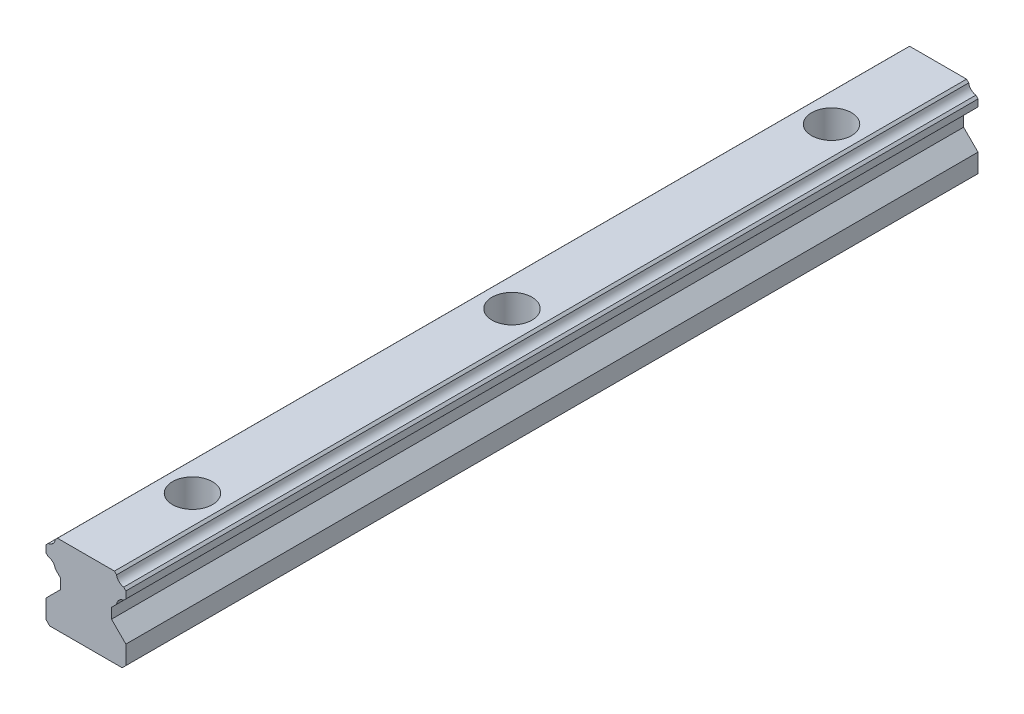
ISO-10303-21;
HEADER;
FILE_DESCRIPTION(('STEP AP214'),'2;1');
FILE_NAME('part.step','',(''),(''),'','','');
FILE_SCHEMA(('AUTOMOTIVE_DESIGN { 1 0 10303 214 1 1 1 1 }'));
ENDSEC;
DATA;
#1=APPLICATION_CONTEXT('core data for automotive mechanical design processes');
#2=APPLICATION_PROTOCOL_DEFINITION('international standard','automotive_design',2000,#1);
#3=PRODUCT_CONTEXT('',#1,'mechanical');
#4=PRODUCT('Part','Part','',(#3));
#5=PRODUCT_RELATED_PRODUCT_CATEGORY('part','',(#4));
#6=PRODUCT_DEFINITION_FORMATION('','',#4);
#7=PRODUCT_DEFINITION_CONTEXT('part definition',#1,'design');
#8=PRODUCT_DEFINITION('design','',#6,#7);
#9=PRODUCT_DEFINITION_SHAPE('','',#8);
#10=(LENGTH_UNIT() NAMED_UNIT(*) SI_UNIT(.MILLI.,.METRE.));
#11=(NAMED_UNIT(*) PLANE_ANGLE_UNIT() SI_UNIT($,.RADIAN.));
#12=(NAMED_UNIT(*) SI_UNIT($,.STERADIAN.) SOLID_ANGLE_UNIT());
#13=UNCERTAINTY_MEASURE_WITH_UNIT(LENGTH_MEASURE(1.E-05),#10,'distance_accuracy_value','');
#14=(GEOMETRIC_REPRESENTATION_CONTEXT(3) GLOBAL_UNCERTAINTY_ASSIGNED_CONTEXT((#13)) GLOBAL_UNIT_ASSIGNED_CONTEXT((#10,
#11,#12)) REPRESENTATION_CONTEXT('',''));
#15=CARTESIAN_POINT('',(0.,0.,0.));
#16=DIRECTION('',(0.,0.,1.));
#17=DIRECTION('',(1.,0.,0.));
#18=AXIS2_PLACEMENT_3D('',#15,#16,#17);
#19=CARTESIAN_POINT('',(5.3500197001096,15.,-160.));
#20=DIRECTION('',(0.,1.,0.));
#21=DIRECTION('',(-1.,0.,0.));
#22=AXIS2_PLACEMENT_3D('',#19,#20,#21);
#23=PLANE('',#22);
#24=CARTESIAN_POINT('',(0.,15.,-80.));
#25=DIRECTION('',(0.,1.,0.));
#26=DIRECTION('',(0.,0.,1.));
#27=AXIS2_PLACEMENT_3D('',#24,#25,#26);
#28=CIRCLE('',#27,3.75000000000001);
#29=CARTESIAN_POINT('',(0.,15.,-76.25));
#30=VERTEX_POINT('',#29);
#31=EDGE_CURVE('E480',#30,#30,#28,.T.);
#32=ORIENTED_EDGE('',*,*,#31,.F.);
#33=EDGE_LOOP('',(#32));
#34=FACE_BOUND('',#33,.T.);
#35=DIRECTION('',(-1.,0.,0.));
#36=VECTOR('',#35,1.);
#37=CARTESIAN_POINT('',(5.3500197001096,15.,0.));
#38=LINE('',#37,#36);
#39=CARTESIAN_POINT('',(5.3500197001096,15.,0.));
#40=VERTEX_POINT('',#39);
#41=CARTESIAN_POINT('',(-5.3500197001096,15.,0.));
#42=VERTEX_POINT('',#41);
#43=EDGE_CURVE('E271',#40,#42,#38,.T.);
#44=ORIENTED_EDGE('',*,*,#43,.F.);
#45=DIRECTION('',(0.,0.,1.));
#46=VECTOR('',#45,1.);
#47=CARTESIAN_POINT('',(5.3500197001096,15.,-160.));
#48=LINE('',#47,#46);
#49=CARTESIAN_POINT('',(5.3500197001096,15.,-160.));
#50=VERTEX_POINT('',#49);
#51=EDGE_CURVE('E313',#50,#40,#48,.T.);
#52=ORIENTED_EDGE('',*,*,#51,.F.);
#53=DIRECTION('',(-1.,0.,0.));
#54=VECTOR('',#53,1.);
#55=CARTESIAN_POINT('',(5.3500197001096,15.,-160.));
#56=LINE('',#55,#54);
#57=CARTESIAN_POINT('',(-5.3500197001096,15.,-160.));
#58=VERTEX_POINT('',#57);
#59=EDGE_CURVE('E533',#50,#58,#56,.T.);
#60=ORIENTED_EDGE('',*,*,#59,.T.);
#61=DIRECTION('',(0.,0.,1.));
#62=VECTOR('',#61,1.);
#63=CARTESIAN_POINT('',(-5.3500197001096,15.,-160.));
#64=LINE('',#63,#62);
#65=EDGE_CURVE('E311',#58,#42,#64,.T.);
#66=ORIENTED_EDGE('',*,*,#65,.T.);
#67=EDGE_LOOP('',(#44,#52,#60,#66));
#68=FACE_BOUND('',#67,.T.);
#69=CARTESIAN_POINT('',(0.,15.,-20.));
#70=DIRECTION('',(0.,1.,0.));
#71=DIRECTION('',(0.,0.,1.));
#72=AXIS2_PLACEMENT_3D('',#69,#70,#71);
#73=CIRCLE('',#72,3.75000000000001);
#74=CARTESIAN_POINT('',(0.,15.,-16.25));
#75=VERTEX_POINT('',#74);
#76=EDGE_CURVE('E232',#75,#75,#73,.T.);
#77=ORIENTED_EDGE('',*,*,#76,.F.);
#78=EDGE_LOOP('',(#77));
#79=FACE_BOUND('',#78,.T.);
#80=CARTESIAN_POINT('',(0.,15.,-140.));
#81=DIRECTION('',(0.,1.,0.));
#82=DIRECTION('',(0.,0.,1.));
#83=AXIS2_PLACEMENT_3D('',#80,#81,#82);
#84=CIRCLE('',#83,3.75000000000001);
#85=CARTESIAN_POINT('',(0.,15.,-136.25));
#86=VERTEX_POINT('',#85);
#87=EDGE_CURVE('E468',#86,#86,#84,.T.);
#88=ORIENTED_EDGE('',*,*,#87,.F.);
#89=EDGE_LOOP('',(#88));
#90=FACE_BOUND('',#89,.T.);
#91=ADVANCED_FACE('F34',(#34,#68,#79,#90),#23,.T.);
#92=CARTESIAN_POINT('',(-6.8000072137317,0.,-160.));
#93=DIRECTION('',(0.,-1.,0.));
#94=DIRECTION('',(1.,0.,0.));
#95=AXIS2_PLACEMENT_3D('',#92,#93,#94);
#96=PLANE('',#95);
#97=CARTESIAN_POINT('',(0.,0.,-80.));
#98=DIRECTION('',(0.,1.,0.));
#99=DIRECTION('',(0.,0.,1.));
#100=AXIS2_PLACEMENT_3D('',#97,#98,#99);
#101=CIRCLE('',#100,2.25);
#102=CARTESIAN_POINT('',(0.,0.,-77.75));
#103=VERTEX_POINT('',#102);
#104=EDGE_CURVE('E471',#103,#103,#101,.T.);
#105=ORIENTED_EDGE('',*,*,#104,.T.);
#106=EDGE_LOOP('',(#105));
#107=FACE_BOUND('',#106,.T.);
#108=DIRECTION('',(1.,0.,0.));
#109=VECTOR('',#108,1.);
#110=CARTESIAN_POINT('',(-6.8000072137317,0.,0.));
#111=LINE('',#110,#109);
#112=CARTESIAN_POINT('',(-6.8000072137317,0.,0.));
#113=VERTEX_POINT('',#112);
#114=CARTESIAN_POINT('',(6.8000072137317,0.,0.));
#115=VERTEX_POINT('',#114);
#116=EDGE_CURVE('E235',#113,#115,#111,.T.);
#117=ORIENTED_EDGE('',*,*,#116,.F.);
#118=DIRECTION('',(0.,0.,1.));
#119=VECTOR('',#118,1.);
#120=CARTESIAN_POINT('',(-6.8000072137317,0.,-160.));
#121=LINE('',#120,#119);
#122=CARTESIAN_POINT('',(-6.8000072137317,0.,-160.));
#123=VERTEX_POINT('',#122);
#124=EDGE_CURVE('E336',#123,#113,#121,.T.);
#125=ORIENTED_EDGE('',*,*,#124,.F.);
#126=DIRECTION('',(1.,0.,0.));
#127=VECTOR('',#126,1.);
#128=CARTESIAN_POINT('',(-6.8000072137317,0.,-160.));
#129=LINE('',#128,#127);
#130=CARTESIAN_POINT('',(6.8000072137317,0.,-160.));
#131=VERTEX_POINT('',#130);
#132=EDGE_CURVE('E497',#123,#131,#129,.T.);
#133=ORIENTED_EDGE('',*,*,#132,.T.);
#134=DIRECTION('',(0.,0.,1.));
#135=VECTOR('',#134,1.);
#136=CARTESIAN_POINT('',(6.8000072137317,0.,-160.));
#137=LINE('',#136,#135);
#138=EDGE_CURVE('E335',#131,#115,#137,.T.);
#139=ORIENTED_EDGE('',*,*,#138,.T.);
#140=EDGE_LOOP('',(#117,#125,#133,#139));
#141=FACE_BOUND('',#140,.T.);
#142=CARTESIAN_POINT('',(0.,0.,-20.));
#143=DIRECTION('',(0.,1.,0.));
#144=DIRECTION('',(0.,0.,1.));
#145=AXIS2_PLACEMENT_3D('',#142,#143,#144);
#146=CIRCLE('',#145,2.25);
#147=CARTESIAN_POINT('',(0.,0.,-17.75));
#148=VERTEX_POINT('',#147);
#149=EDGE_CURVE('E483',#148,#148,#146,.T.);
#150=ORIENTED_EDGE('',*,*,#149,.T.);
#151=EDGE_LOOP('',(#150));
#152=FACE_BOUND('',#151,.T.);
#153=CARTESIAN_POINT('',(0.,0.,-140.));
#154=DIRECTION('',(0.,1.,0.));
#155=DIRECTION('',(0.,0.,1.));
#156=AXIS2_PLACEMENT_3D('',#153,#154,#155);
#157=CIRCLE('',#156,2.25);
#158=CARTESIAN_POINT('',(0.,0.,-137.75));
#159=VERTEX_POINT('',#158);
#160=EDGE_CURVE('E460',#159,#159,#157,.T.);
#161=ORIENTED_EDGE('',*,*,#160,.T.);
#162=EDGE_LOOP('',(#161));
#163=FACE_BOUND('',#162,.T.);
#164=ADVANCED_FACE('F349',(#107,#141,#152,#163),#96,.T.);
#165=CARTESIAN_POINT('',(-7.5,4.2000245999998,-160.));
#166=DIRECTION('',(-1.,0.,0.));
#167=DIRECTION('',(0.,0.,1.));
#168=AXIS2_PLACEMENT_3D('',#165,#166,#167);
#169=PLANE('',#168);
#170=DIRECTION('',(0.,-1.,0.));
#171=VECTOR('',#170,1.);
#172=CARTESIAN_POINT('',(-7.5,4.2000245999998,0.));
#173=LINE('',#172,#171);
#174=CARTESIAN_POINT('',(-7.5,4.2000245999998,0.));
#175=VERTEX_POINT('',#174);
#176=CARTESIAN_POINT('',(-7.5,0.699992710002539,0.));
#177=VERTEX_POINT('',#176);
#178=EDGE_CURVE('E228',#175,#177,#173,.T.);
#179=ORIENTED_EDGE('',*,*,#178,.F.);
#180=DIRECTION('',(0.,0.,1.));
#181=VECTOR('',#180,1.);
#182=CARTESIAN_POINT('',(-7.5,4.2000245999998,-160.));
#183=LINE('',#182,#181);
#184=CARTESIAN_POINT('',(-7.5,4.2000245999998,-160.));
#185=VERTEX_POINT('',#184);
#186=EDGE_CURVE('E11',#185,#175,#183,.T.);
#187=ORIENTED_EDGE('',*,*,#186,.F.);
#188=DIRECTION('',(0.,-1.,0.));
#189=VECTOR('',#188,1.);
#190=CARTESIAN_POINT('',(-7.5,4.2000245999998,-160.));
#191=LINE('',#190,#189);
#192=CARTESIAN_POINT('',(-7.5,0.699992710002539,-160.));
#193=VERTEX_POINT('',#192);
#194=EDGE_CURVE('E297',#185,#193,#191,.T.);
#195=ORIENTED_EDGE('',*,*,#194,.T.);
#196=DIRECTION('',(0.,0.,1.));
#197=VECTOR('',#196,1.);
#198=CARTESIAN_POINT('',(-7.5,0.699992710002539,-160.));
#199=LINE('',#198,#197);
#200=EDGE_CURVE('E38',#193,#177,#199,.T.);
#201=ORIENTED_EDGE('',*,*,#200,.T.);
#202=EDGE_LOOP('',(#179,#187,#195,#201));
#203=FACE_BOUND('',#202,.T.);
#204=ADVANCED_FACE('F36',(#203),#169,.T.);
#205=CARTESIAN_POINT('',(-4.8000182999995,6.9000063000003,-160.));
#206=DIRECTION('',(-0.707106781186548,0.707106781186548,0.));
#207=DIRECTION('',(-0.707106781186548,-0.707106781186548,0.));
#208=AXIS2_PLACEMENT_3D('',#205,#206,#207);
#209=PLANE('',#208);
#210=DIRECTION('',(-0.707106781186548,-0.707106781186548,0.));
#211=VECTOR('',#210,1.);
#212=CARTESIAN_POINT('',(-4.8000182999995,6.9000063000003,0.));
#213=LINE('',#212,#211);
#214=CARTESIAN_POINT('',(-4.8000182999995,6.9000063000003,0.));
#215=VERTEX_POINT('',#214);
#216=EDGE_CURVE('E295',#215,#175,#213,.T.);
#217=ORIENTED_EDGE('',*,*,#216,.F.);
#218=DIRECTION('',(0.,0.,1.));
#219=VECTOR('',#218,1.);
#220=CARTESIAN_POINT('',(-4.8000182999995,6.9000063000003,-160.));
#221=LINE('',#220,#219);
#222=CARTESIAN_POINT('',(-4.8000182999995,6.9000063000003,-160.));
#223=VERTEX_POINT('',#222);
#224=EDGE_CURVE('E44',#223,#215,#221,.T.);
#225=ORIENTED_EDGE('',*,*,#224,.F.);
#226=DIRECTION('',(-0.707106781186548,-0.707106781186548,0.));
#227=VECTOR('',#226,1.);
#228=CARTESIAN_POINT('',(-4.8000182999995,6.9000063000003,-160.));
#229=LINE('',#228,#227);
#230=EDGE_CURVE('E218',#223,#185,#229,.T.);
#231=ORIENTED_EDGE('',*,*,#230,.T.);
#232=ORIENTED_EDGE('',*,*,#186,.T.);
#233=EDGE_LOOP('',(#217,#225,#231,#232));
#234=FACE_BOUND('',#233,.T.);
#235=ADVANCED_FACE('F341',(#234),#209,.T.);
#236=CARTESIAN_POINT('',(-4.8000182999995,8.8400053999999,-160.));
#237=DIRECTION('',(-1.,0.,0.));
#238=DIRECTION('',(0.,0.,1.));
#239=AXIS2_PLACEMENT_3D('',#236,#237,#238);
#240=PLANE('',#239);
#241=DIRECTION('',(0.,-1.,0.));
#242=VECTOR('',#241,1.);
#243=CARTESIAN_POINT('',(-4.8000182999995,8.8400053999999,0.));
#244=LINE('',#243,#242);
#245=CARTESIAN_POINT('',(-4.8000182999995,8.8400053999999,0.));
#246=VERTEX_POINT('',#245);
#247=EDGE_CURVE('E205',#246,#215,#244,.T.);
#248=ORIENTED_EDGE('',*,*,#247,.F.);
#249=DIRECTION('',(0.,0.,1.));
#250=VECTOR('',#249,1.);
#251=CARTESIAN_POINT('',(-4.8000182999995,8.8400053999999,-160.));
#252=LINE('',#251,#250);
#253=CARTESIAN_POINT('',(-4.8000182999995,8.8400053999999,-160.));
#254=VERTEX_POINT('',#253);
#255=EDGE_CURVE('E200',#254,#246,#252,.T.);
#256=ORIENTED_EDGE('',*,*,#255,.F.);
#257=DIRECTION('',(0.,-1.,0.));
#258=VECTOR('',#257,1.);
#259=CARTESIAN_POINT('',(-4.8000182999995,8.8400053999999,-160.));
#260=LINE('',#259,#258);
#261=EDGE_CURVE('E203',#254,#223,#260,.T.);
#262=ORIENTED_EDGE('',*,*,#261,.T.);
#263=ORIENTED_EDGE('',*,*,#224,.T.);
#264=EDGE_LOOP('',(#248,#256,#262,#263));
#265=FACE_BOUND('',#264,.T.);
#266=ADVANCED_FACE('F202',(#265),#240,.T.);
#267=CARTESIAN_POINT('',(-5.7559468125191,9.794179117755,-160.));
#268=DIRECTION('',(-0.706456870044271,-0.707756095535215,0.));
#269=DIRECTION('',(0.707756095535215,-0.706456870044271,0.));
#270=AXIS2_PLACEMENT_3D('',#267,#268,#269);
#271=PLANE('',#270);
#272=DIRECTION('',(0.707756095535215,-0.706456870044271,0.));
#273=VECTOR('',#272,1.);
#274=CARTESIAN_POINT('',(-5.7559468125191,9.794179117755,0.));
#275=LINE('',#274,#273);
#276=CARTESIAN_POINT('',(-5.7559468125191,9.794179117755,0.));
#277=VERTEX_POINT('',#276);
#278=EDGE_CURVE('E292',#277,#246,#275,.T.);
#279=ORIENTED_EDGE('',*,*,#278,.F.);
#280=DIRECTION('',(0.,0.,1.));
#281=VECTOR('',#280,1.);
#282=CARTESIAN_POINT('',(-5.7559468125191,9.794179117755,-160.));
#283=LINE('',#282,#281);
#284=CARTESIAN_POINT('',(-5.7559468125191,9.794179117755,-160.));
#285=VERTEX_POINT('',#284);
#286=EDGE_CURVE('E210',#285,#277,#283,.T.);
#287=ORIENTED_EDGE('',*,*,#286,.F.);
#288=DIRECTION('',(0.707756095535215,-0.706456870044271,0.));
#289=VECTOR('',#288,1.);
#290=CARTESIAN_POINT('',(-5.7559468125191,9.794179117755,-160.));
#291=LINE('',#290,#289);
#292=EDGE_CURVE('E216',#285,#254,#291,.T.);
#293=ORIENTED_EDGE('',*,*,#292,.T.);
#294=ORIENTED_EDGE('',*,*,#255,.T.);
#295=EDGE_LOOP('',(#279,#287,#293,#294));
#296=FACE_BOUND('',#295,.T.);
#297=ADVANCED_FACE('F220',(#296),#271,.T.);
#298=CARTESIAN_POINT('',(-7.30229328109914,9.58823668135776,-160.));
#299=DIRECTION('',(0.,0.,1.));
#300=DIRECTION('',(1.,0.,0.));
#301=AXIS2_PLACEMENT_3D('',#298,#299,#300);
#302=CYLINDRICAL_SURFACE('',#301,1.55999989999974);
#303=CARTESIAN_POINT('',(-7.30229328109914,9.58823668135776,0.));
#304=DIRECTION('',(0.,0.,-1.));
#305=DIRECTION('',(-1.,0.,0.));
#306=AXIS2_PLACEMENT_3D('',#303,#304,#305);
#307=CIRCLE('',#306,1.55999989999974);
#308=CARTESIAN_POINT('',(-7.0943256899454,11.134312089942,0.));
#309=VERTEX_POINT('',#308);
#310=EDGE_CURVE('E289',#309,#277,#307,.T.);
#311=ORIENTED_EDGE('',*,*,#310,.F.);
#312=DIRECTION('',(0.,0.,1.));
#313=VECTOR('',#312,1.);
#314=CARTESIAN_POINT('',(-7.0943256899454,11.134312089942,-160.));
#315=LINE('',#314,#313);
#316=CARTESIAN_POINT('',(-7.0943256899454,11.134312089942,-160.));
#317=VERTEX_POINT('',#316);
#318=EDGE_CURVE('E301',#317,#309,#315,.T.);
#319=ORIENTED_EDGE('',*,*,#318,.F.);
#320=CARTESIAN_POINT('',(-7.30229328109914,9.58823668135776,-160.));
#321=DIRECTION('',(0.,0.,-1.));
#322=DIRECTION('',(-1.,0.,0.));
#323=AXIS2_PLACEMENT_3D('',#320,#321,#322);
#324=CIRCLE('',#323,1.55999989999974);
#325=EDGE_CURVE('E221',#317,#285,#324,.T.);
#326=ORIENTED_EDGE('',*,*,#325,.T.);
#327=ORIENTED_EDGE('',*,*,#286,.T.);
#328=EDGE_LOOP('',(#311,#319,#326,#327));
#329=FACE_BOUND('',#328,.T.);
#330=ADVANCED_FACE('F597',(#329),#302,.F.);
#331=CARTESIAN_POINT('',(-7.5,11.539986599989,-160.));
#332=DIRECTION('',(-0.707106955483918,-0.707106606889134,0.));
#333=DIRECTION('',(0.707106606889134,-0.707106955483918,0.));
#334=AXIS2_PLACEMENT_3D('',#331,#332,#333);
#335=PLANE('',#334);
#336=DIRECTION('',(0.707106606889134,-0.707106955483918,0.));
#337=VECTOR('',#336,1.);
#338=CARTESIAN_POINT('',(-7.5,11.539986599989,0.));
#339=LINE('',#338,#337);
#340=CARTESIAN_POINT('',(-7.5,11.539986599989,0.));
#341=VERTEX_POINT('',#340);
#342=EDGE_CURVE('E286',#341,#309,#339,.T.);
#343=ORIENTED_EDGE('',*,*,#342,.F.);
#344=DIRECTION('',(0.,0.,1.));
#345=VECTOR('',#344,1.);
#346=CARTESIAN_POINT('',(-7.5,11.539986599989,-160.));
#347=LINE('',#346,#345);
#348=CARTESIAN_POINT('',(-7.5,11.539986599989,-160.));
#349=VERTEX_POINT('',#348);
#350=EDGE_CURVE('E303',#349,#341,#347,.T.);
#351=ORIENTED_EDGE('',*,*,#350,.F.);
#352=DIRECTION('',(0.707106606889134,-0.707106955483918,0.));
#353=VECTOR('',#352,1.);
#354=CARTESIAN_POINT('',(-7.5,11.539986599989,-160.));
#355=LINE('',#354,#353);
#356=EDGE_CURVE('E223',#349,#317,#355,.T.);
#357=ORIENTED_EDGE('',*,*,#356,.T.);
#358=ORIENTED_EDGE('',*,*,#318,.T.);
#359=EDGE_LOOP('',(#343,#351,#357,#358));
#360=FACE_BOUND('',#359,.T.);
#361=ADVANCED_FACE('F551',(#360),#335,.T.);
#362=CARTESIAN_POINT('',(-7.5,12.850020399955,-160.));
#363=DIRECTION('',(-1.,0.,0.));
#364=DIRECTION('',(0.,0.,1.));
#365=AXIS2_PLACEMENT_3D('',#362,#363,#364);
#366=PLANE('',#365);
#367=DIRECTION('',(0.,-1.,0.));
#368=VECTOR('',#367,1.);
#369=CARTESIAN_POINT('',(-7.5,12.850020399955,0.));
#370=LINE('',#369,#368);
#371=CARTESIAN_POINT('',(-7.5,12.850020399955,0.));
#372=VERTEX_POINT('',#371);
#373=EDGE_CURVE('E283',#372,#341,#370,.T.);
#374=ORIENTED_EDGE('',*,*,#373,.F.);
#375=DIRECTION('',(0.,0.,1.));
#376=VECTOR('',#375,1.);
#377=CARTESIAN_POINT('',(-7.5,12.850020399955,-160.));
#378=LINE('',#377,#376);
#379=CARTESIAN_POINT('',(-7.5,12.850020399955,-160.));
#380=VERTEX_POINT('',#379);
#381=EDGE_CURVE('E305',#380,#372,#378,.T.);
#382=ORIENTED_EDGE('',*,*,#381,.F.);
#383=DIRECTION('',(0.,-1.,0.));
#384=VECTOR('',#383,1.);
#385=CARTESIAN_POINT('',(-7.5,12.850020399955,-160.));
#386=LINE('',#385,#384);
#387=EDGE_CURVE('E545',#380,#349,#386,.T.);
#388=ORIENTED_EDGE('',*,*,#387,.T.);
#389=ORIENTED_EDGE('',*,*,#350,.T.);
#390=EDGE_LOOP('',(#374,#382,#388,#389));
#391=FACE_BOUND('',#390,.T.);
#392=ADVANCED_FACE('F557',(#391),#366,.T.);
#393=CARTESIAN_POINT('',(-7.0943256899454,13.268442750921,-160.));
#394=DIRECTION('',(-0.717959196634107,0.696085190166051,0.));
#395=DIRECTION('',(-0.696085190166051,-0.717959196634107,0.));
#396=AXIS2_PLACEMENT_3D('',#393,#394,#395);
#397=PLANE('',#396);
#398=DIRECTION('',(-0.696085190166051,-0.717959196634107,0.));
#399=VECTOR('',#398,1.);
#400=CARTESIAN_POINT('',(-7.0943256899454,13.268442750921,0.));
#401=LINE('',#400,#399);
#402=CARTESIAN_POINT('',(-7.0943256899454,13.268442750921,0.));
#403=VERTEX_POINT('',#402);
#404=EDGE_CURVE('E280',#403,#372,#401,.T.);
#405=ORIENTED_EDGE('',*,*,#404,.F.);
#406=DIRECTION('',(0.,0.,1.));
#407=VECTOR('',#406,1.);
#408=CARTESIAN_POINT('',(-7.0943256899454,13.268442750921,-160.));
#409=LINE('',#408,#407);
#410=CARTESIAN_POINT('',(-7.0943256899454,13.268442750921,-160.));
#411=VERTEX_POINT('',#410);
#412=EDGE_CURVE('E307',#411,#403,#409,.T.);
#413=ORIENTED_EDGE('',*,*,#412,.F.);
#414=DIRECTION('',(-0.696085190166051,-0.717959196634107,0.));
#415=VECTOR('',#414,1.);
#416=CARTESIAN_POINT('',(-7.0943256899454,13.268442750921,-160.));
#417=LINE('',#416,#415);
#418=EDGE_CURVE('E542',#411,#380,#417,.T.);
#419=ORIENTED_EDGE('',*,*,#418,.T.);
#420=ORIENTED_EDGE('',*,*,#381,.T.);
#421=EDGE_LOOP('',(#405,#413,#419,#420));
#422=FACE_BOUND('',#421,.T.);
#423=ADVANCED_FACE('F560',(#422),#397,.T.);
#424=CARTESIAN_POINT('',(-7.30025219070474,14.8147913417259,-160.));
#425=DIRECTION('',(0.,0.,1.));
#426=DIRECTION('',(1.,0.,0.));
#427=AXIS2_PLACEMENT_3D('',#424,#425,#426);
#428=CYLINDRICAL_SURFACE('',#427,1.55999989999974);
#429=CARTESIAN_POINT('',(-7.30025219070474,14.8147913417259,0.));
#430=DIRECTION('',(0.,0.,-1.));
#431=DIRECTION('',(-1.,0.,0.));
#432=AXIS2_PLACEMENT_3D('',#429,#430,#431);
#433=CIRCLE('',#432,1.55999989999974);
#434=CARTESIAN_POINT('',(-5.7559468125191,14.594063937659,0.));
#435=VERTEX_POINT('',#434);
#436=EDGE_CURVE('E277',#435,#403,#433,.T.);
#437=ORIENTED_EDGE('',*,*,#436,.F.);
#438=DIRECTION('',(0.,0.,1.));
#439=VECTOR('',#438,1.);
#440=CARTESIAN_POINT('',(-5.7559468125191,14.594063937659,-160.));
#441=LINE('',#440,#439);
#442=CARTESIAN_POINT('',(-5.7559468125191,14.594063937659,-160.));
#443=VERTEX_POINT('',#442);
#444=EDGE_CURVE('E309',#443,#435,#441,.T.);
#445=ORIENTED_EDGE('',*,*,#444,.F.);
#446=CARTESIAN_POINT('',(-7.30025219070474,14.8147913417259,-160.));
#447=DIRECTION('',(0.,0.,-1.));
#448=DIRECTION('',(-1.,0.,0.));
#449=AXIS2_PLACEMENT_3D('',#446,#447,#448);
#450=CIRCLE('',#449,1.55999989999974);
#451=EDGE_CURVE('E539',#443,#411,#450,.T.);
#452=ORIENTED_EDGE('',*,*,#451,.T.);
#453=ORIENTED_EDGE('',*,*,#412,.T.);
#454=EDGE_LOOP('',(#437,#445,#452,#453));
#455=FACE_BOUND('',#454,.T.);
#456=ADVANCED_FACE('F565',(#455),#428,.F.);
#457=CARTESIAN_POINT('',(-5.3500197001096,15.,-160.));
#458=DIRECTION('',(-0.70711457624681,0.707098986040352,0.));
#459=DIRECTION('',(-0.707098986040352,-0.70711457624681,0.));
#460=AXIS2_PLACEMENT_3D('',#457,#458,#459);
#461=PLANE('',#460);
#462=DIRECTION('',(-0.707098986040352,-0.70711457624681,0.));
#463=VECTOR('',#462,1.);
#464=CARTESIAN_POINT('',(-5.3500197001096,15.,0.));
#465=LINE('',#464,#463);
#466=EDGE_CURVE('E274',#42,#435,#465,.T.);
#467=ORIENTED_EDGE('',*,*,#466,.F.);
#468=ORIENTED_EDGE('',*,*,#65,.F.);
#469=DIRECTION('',(-0.707098986040352,-0.70711457624681,0.));
#470=VECTOR('',#469,1.);
#471=CARTESIAN_POINT('',(-5.3500197001096,15.,-160.));
#472=LINE('',#471,#470);
#473=EDGE_CURVE('E536',#58,#443,#472,.T.);
#474=ORIENTED_EDGE('',*,*,#473,.T.);
#475=ORIENTED_EDGE('',*,*,#444,.T.);
#476=EDGE_LOOP('',(#467,#468,#474,#475));
#477=FACE_BOUND('',#476,.T.);
#478=ADVANCED_FACE('F363',(#477),#461,.T.);
#479=CARTESIAN_POINT('',(5.3500197001096,15.,-160.));
#480=DIRECTION('',(0.707114576246815,0.707098986040348,0.));
#481=DIRECTION('',(-0.707098986040348,0.707114576246815,0.));
#482=AXIS2_PLACEMENT_3D('',#479,#480,#481);
#483=PLANE('',#482);
#484=DIRECTION('',(-0.707098986040348,0.707114576246815,0.));
#485=VECTOR('',#484,1.);
#486=CARTESIAN_POINT('',(5.3500197001096,15.,0.));
#487=LINE('',#486,#485);
#488=CARTESIAN_POINT('',(5.75594681251909,14.594063937659,0.));
#489=VERTEX_POINT('',#488);
#490=EDGE_CURVE('E268',#489,#40,#487,.T.);
#491=ORIENTED_EDGE('',*,*,#490,.F.);
#492=DIRECTION('',(0.,0.,1.));
#493=VECTOR('',#492,1.);
#494=CARTESIAN_POINT('',(5.75594681251909,14.594063937659,-160.));
#495=LINE('',#494,#493);
#496=CARTESIAN_POINT('',(5.75594681251909,14.594063937659,-160.));
#497=VERTEX_POINT('',#496);
#498=EDGE_CURVE('E315',#497,#489,#495,.T.);
#499=ORIENTED_EDGE('',*,*,#498,.F.);
#500=DIRECTION('',(-0.707098986040348,0.707114576246815,0.));
#501=VECTOR('',#500,1.);
#502=CARTESIAN_POINT('',(5.3500197001096,15.,-160.));
#503=LINE('',#502,#501);
#504=EDGE_CURVE('E530',#497,#50,#503,.T.);
#505=ORIENTED_EDGE('',*,*,#504,.T.);
#506=ORIENTED_EDGE('',*,*,#51,.T.);
#507=EDGE_LOOP('',(#491,#499,#505,#506));
#508=FACE_BOUND('',#507,.T.);
#509=ADVANCED_FACE('F365',(#508),#483,.T.);
#510=CARTESIAN_POINT('',(7.30025219070473,14.8147913417259,-160.));
#511=DIRECTION('',(0.,0.,1.));
#512=DIRECTION('',(1.,0.,0.));
#513=AXIS2_PLACEMENT_3D('',#510,#511,#512);
#514=CYLINDRICAL_SURFACE('',#513,1.55999989999974);
#515=CARTESIAN_POINT('',(7.30025219070473,14.8147913417259,0.));
#516=DIRECTION('',(0.,0.,-1.));
#517=DIRECTION('',(1.,0.,0.));
#518=AXIS2_PLACEMENT_3D('',#515,#516,#517);
#519=CIRCLE('',#518,1.55999989999974);
#520=CARTESIAN_POINT('',(7.09432568994539,13.268442750921,0.));
#521=VERTEX_POINT('',#520);
#522=EDGE_CURVE('E265',#521,#489,#519,.T.);
#523=ORIENTED_EDGE('',*,*,#522,.F.);
#524=DIRECTION('',(0.,0.,1.));
#525=VECTOR('',#524,1.);
#526=CARTESIAN_POINT('',(7.09432568994539,13.268442750921,-160.));
#527=LINE('',#526,#525);
#528=CARTESIAN_POINT('',(7.09432568994539,13.268442750921,-160.));
#529=VERTEX_POINT('',#528);
#530=EDGE_CURVE('E317',#529,#521,#527,.T.);
#531=ORIENTED_EDGE('',*,*,#530,.F.);
#532=CARTESIAN_POINT('',(7.30025219070473,14.8147913417259,-160.));
#533=DIRECTION('',(0.,0.,-1.));
#534=DIRECTION('',(1.,0.,0.));
#535=AXIS2_PLACEMENT_3D('',#532,#533,#534);
#536=CIRCLE('',#535,1.55999989999974);
#537=EDGE_CURVE('E527',#529,#497,#536,.T.);
#538=ORIENTED_EDGE('',*,*,#537,.T.);
#539=ORIENTED_EDGE('',*,*,#498,.T.);
#540=EDGE_LOOP('',(#523,#531,#538,#539));
#541=FACE_BOUND('',#540,.T.);
#542=ADVANCED_FACE('F368',(#541),#514,.F.);
#543=CARTESIAN_POINT('',(7.09432568994539,13.268442750921,-160.));
#544=DIRECTION('',(0.717959196634104,0.696085190166054,0.));
#545=DIRECTION('',(-0.696085190166054,0.717959196634104,0.));
#546=AXIS2_PLACEMENT_3D('',#543,#544,#545);
#547=PLANE('',#546);
#548=DIRECTION('',(-0.696085190166054,0.717959196634104,0.));
#549=VECTOR('',#548,1.);
#550=CARTESIAN_POINT('',(7.09432568994539,13.268442750921,0.));
#551=LINE('',#550,#549);
#552=CARTESIAN_POINT('',(7.5,12.850020399955,0.));
#553=VERTEX_POINT('',#552);
#554=EDGE_CURVE('E262',#553,#521,#551,.T.);
#555=ORIENTED_EDGE('',*,*,#554,.F.);
#556=DIRECTION('',(0.,0.,1.));
#557=VECTOR('',#556,1.);
#558=CARTESIAN_POINT('',(7.5,12.850020399955,-160.));
#559=LINE('',#558,#557);
#560=CARTESIAN_POINT('',(7.5,12.850020399955,-160.));
#561=VERTEX_POINT('',#560);
#562=EDGE_CURVE('E319',#561,#553,#559,.T.);
#563=ORIENTED_EDGE('',*,*,#562,.F.);
#564=DIRECTION('',(-0.696085190166054,0.717959196634104,0.));
#565=VECTOR('',#564,1.);
#566=CARTESIAN_POINT('',(7.09432568994539,13.268442750921,-160.));
#567=LINE('',#566,#565);
#568=EDGE_CURVE('E524',#561,#529,#567,.T.);
#569=ORIENTED_EDGE('',*,*,#568,.T.);
#570=ORIENTED_EDGE('',*,*,#530,.T.);
#571=EDGE_LOOP('',(#555,#563,#569,#570));
#572=FACE_BOUND('',#571,.T.);
#573=ADVANCED_FACE('F372',(#572),#547,.T.);
#574=CARTESIAN_POINT('',(7.5,12.850020399955,-160.));
#575=DIRECTION('',(1.,0.,0.));
#576=DIRECTION('',(0.,0.,-1.));
#577=AXIS2_PLACEMENT_3D('',#574,#575,#576);
#578=PLANE('',#577);
#579=DIRECTION('',(0.,1.,0.));
#580=VECTOR('',#579,1.);
#581=CARTESIAN_POINT('',(7.5,12.850020399955,0.));
#582=LINE('',#581,#580);
#583=CARTESIAN_POINT('',(7.5,11.539986599989,0.));
#584=VERTEX_POINT('',#583);
#585=EDGE_CURVE('E259',#584,#553,#582,.T.);
#586=ORIENTED_EDGE('',*,*,#585,.F.);
#587=DIRECTION('',(0.,0.,1.));
#588=VECTOR('',#587,1.);
#589=CARTESIAN_POINT('',(7.5,11.539986599989,-160.));
#590=LINE('',#589,#588);
#591=CARTESIAN_POINT('',(7.5,11.539986599989,-160.));
#592=VERTEX_POINT('',#591);
#593=EDGE_CURVE('E321',#592,#584,#590,.T.);
#594=ORIENTED_EDGE('',*,*,#593,.F.);
#595=DIRECTION('',(0.,1.,0.));
#596=VECTOR('',#595,1.);
#597=CARTESIAN_POINT('',(7.5,12.850020399955,-160.));
#598=LINE('',#597,#596);
#599=EDGE_CURVE('E521',#592,#561,#598,.T.);
#600=ORIENTED_EDGE('',*,*,#599,.T.);
#601=ORIENTED_EDGE('',*,*,#562,.T.);
#602=EDGE_LOOP('',(#586,#594,#600,#601));
#603=FACE_BOUND('',#602,.T.);
#604=ADVANCED_FACE('F376',(#603),#578,.T.);
#605=CARTESIAN_POINT('',(7.5,11.539986599989,-160.));
#606=DIRECTION('',(0.707106955483915,-0.707106606889138,0.));
#607=DIRECTION('',(0.707106606889138,0.707106955483915,0.));
#608=AXIS2_PLACEMENT_3D('',#605,#606,#607);
#609=PLANE('',#608);
#610=DIRECTION('',(0.707106606889138,0.707106955483915,0.));
#611=VECTOR('',#610,1.);
#612=CARTESIAN_POINT('',(7.5,11.539986599989,0.));
#613=LINE('',#612,#611);
#614=CARTESIAN_POINT('',(7.09432568994539,11.134312089942,0.));
#615=VERTEX_POINT('',#614);
#616=EDGE_CURVE('E256',#615,#584,#613,.T.);
#617=ORIENTED_EDGE('',*,*,#616,.F.);
#618=DIRECTION('',(0.,0.,1.));
#619=VECTOR('',#618,1.);
#620=CARTESIAN_POINT('',(7.09432568994539,11.134312089942,-160.));
#621=LINE('',#620,#619);
#622=CARTESIAN_POINT('',(7.09432568994539,11.134312089942,-160.));
#623=VERTEX_POINT('',#622);
#624=EDGE_CURVE('E323',#623,#615,#621,.T.);
#625=ORIENTED_EDGE('',*,*,#624,.F.);
#626=DIRECTION('',(0.707106606889138,0.707106955483915,0.));
#627=VECTOR('',#626,1.);
#628=CARTESIAN_POINT('',(7.5,11.539986599989,-160.));
#629=LINE('',#628,#627);
#630=EDGE_CURVE('E518',#623,#592,#629,.T.);
#631=ORIENTED_EDGE('',*,*,#630,.T.);
#632=ORIENTED_EDGE('',*,*,#593,.T.);
#633=EDGE_LOOP('',(#617,#625,#631,#632));
#634=FACE_BOUND('',#633,.T.);
#635=ADVANCED_FACE('F380',(#634),#609,.T.);
#636=CARTESIAN_POINT('',(7.30229328109913,9.58823668135777,-160.));
#637=DIRECTION('',(0.,0.,1.));
#638=DIRECTION('',(1.,0.,0.));
#639=AXIS2_PLACEMENT_3D('',#636,#637,#638);
#640=CYLINDRICAL_SURFACE('',#639,1.55999989999974);
#641=CARTESIAN_POINT('',(7.30229328109913,9.58823668135777,0.));
#642=DIRECTION('',(0.,0.,-1.));
#643=DIRECTION('',(1.,0.,0.));
#644=AXIS2_PLACEMENT_3D('',#641,#642,#643);
#645=CIRCLE('',#644,1.55999989999974);
#646=CARTESIAN_POINT('',(5.7559468125191,9.794179117755,0.));
#647=VERTEX_POINT('',#646);
#648=EDGE_CURVE('E253',#647,#615,#645,.T.);
#649=ORIENTED_EDGE('',*,*,#648,.F.);
#650=DIRECTION('',(0.,0.,1.));
#651=VECTOR('',#650,1.);
#652=CARTESIAN_POINT('',(5.7559468125191,9.794179117755,-160.));
#653=LINE('',#652,#651);
#654=CARTESIAN_POINT('',(5.7559468125191,9.794179117755,-160.));
#655=VERTEX_POINT('',#654);
#656=EDGE_CURVE('E325',#655,#647,#653,.T.);
#657=ORIENTED_EDGE('',*,*,#656,.F.);
#658=CARTESIAN_POINT('',(7.30229328109913,9.58823668135777,-160.));
#659=DIRECTION('',(0.,0.,-1.));
#660=DIRECTION('',(1.,0.,0.));
#661=AXIS2_PLACEMENT_3D('',#658,#659,#660);
#662=CIRCLE('',#661,1.55999989999974);
#663=EDGE_CURVE('E515',#655,#623,#662,.T.);
#664=ORIENTED_EDGE('',*,*,#663,.T.);
#665=ORIENTED_EDGE('',*,*,#624,.T.);
#666=EDGE_LOOP('',(#649,#657,#664,#665));
#667=FACE_BOUND('',#666,.T.);
#668=ADVANCED_FACE('F384',(#667),#640,.F.);
#669=CARTESIAN_POINT('',(5.7559468125191,9.794179117755,-160.));
#670=DIRECTION('',(0.706456870044271,-0.707756095535214,0.));
#671=DIRECTION('',(0.707756095535214,0.706456870044271,0.));
#672=AXIS2_PLACEMENT_3D('',#669,#670,#671);
#673=PLANE('',#672);
#674=DIRECTION('',(0.707756095535214,0.706456870044271,0.));
#675=VECTOR('',#674,1.);
#676=CARTESIAN_POINT('',(5.7559468125191,9.794179117755,0.));
#677=LINE('',#676,#675);
#678=CARTESIAN_POINT('',(4.8000182999995,8.8400053999999,0.));
#679=VERTEX_POINT('',#678);
#680=EDGE_CURVE('E250',#679,#647,#677,.T.);
#681=ORIENTED_EDGE('',*,*,#680,.F.);
#682=DIRECTION('',(0.,0.,1.));
#683=VECTOR('',#682,1.);
#684=CARTESIAN_POINT('',(4.8000182999995,8.8400053999999,-160.));
#685=LINE('',#684,#683);
#686=CARTESIAN_POINT('',(4.8000182999995,8.8400053999999,-160.));
#687=VERTEX_POINT('',#686);
#688=EDGE_CURVE('E327',#687,#679,#685,.T.);
#689=ORIENTED_EDGE('',*,*,#688,.F.);
#690=DIRECTION('',(0.707756095535214,0.706456870044271,0.));
#691=VECTOR('',#690,1.);
#692=CARTESIAN_POINT('',(5.7559468125191,9.794179117755,-160.));
#693=LINE('',#692,#691);
#694=EDGE_CURVE('E512',#687,#655,#693,.T.);
#695=ORIENTED_EDGE('',*,*,#694,.T.);
#696=ORIENTED_EDGE('',*,*,#656,.T.);
#697=EDGE_LOOP('',(#681,#689,#695,#696));
#698=FACE_BOUND('',#697,.T.);
#699=ADVANCED_FACE('F388',(#698),#673,.T.);
#700=CARTESIAN_POINT('',(4.8000182999995,8.8400053999999,-160.));
#701=DIRECTION('',(1.,0.,0.));
#702=DIRECTION('',(0.,0.,-1.));
#703=AXIS2_PLACEMENT_3D('',#700,#701,#702);
#704=PLANE('',#703);
#705=DIRECTION('',(0.,1.,0.));
#706=VECTOR('',#705,1.);
#707=CARTESIAN_POINT('',(4.8000182999995,8.8400053999999,0.));
#708=LINE('',#707,#706);
#709=CARTESIAN_POINT('',(4.8000182999995,6.9000063000003,0.));
#710=VERTEX_POINT('',#709);
#711=EDGE_CURVE('E247',#710,#679,#708,.T.);
#712=ORIENTED_EDGE('',*,*,#711,.F.);
#713=DIRECTION('',(0.,0.,1.));
#714=VECTOR('',#713,1.);
#715=CARTESIAN_POINT('',(4.8000182999995,6.9000063000003,-160.));
#716=LINE('',#715,#714);
#717=CARTESIAN_POINT('',(4.8000182999995,6.9000063000003,-160.));
#718=VERTEX_POINT('',#717);
#719=EDGE_CURVE('E329',#718,#710,#716,.T.);
#720=ORIENTED_EDGE('',*,*,#719,.F.);
#721=DIRECTION('',(0.,1.,0.));
#722=VECTOR('',#721,1.);
#723=CARTESIAN_POINT('',(4.8000182999995,8.8400053999999,-160.));
#724=LINE('',#723,#722);
#725=EDGE_CURVE('E509',#718,#687,#724,.T.);
#726=ORIENTED_EDGE('',*,*,#725,.T.);
#727=ORIENTED_EDGE('',*,*,#688,.T.);
#728=EDGE_LOOP('',(#712,#720,#726,#727));
#729=FACE_BOUND('',#728,.T.);
#730=ADVANCED_FACE('F392',(#729),#704,.T.);
#731=CARTESIAN_POINT('',(4.8000182999995,6.9000063000003,-160.));
#732=DIRECTION('',(0.707106781186548,0.707106781186548,0.));
#733=DIRECTION('',(-0.707106781186548,0.707106781186548,0.));
#734=AXIS2_PLACEMENT_3D('',#731,#732,#733);
#735=PLANE('',#734);
#736=DIRECTION('',(-0.707106781186548,0.707106781186548,0.));
#737=VECTOR('',#736,1.);
#738=CARTESIAN_POINT('',(4.8000182999995,6.9000063000003,0.));
#739=LINE('',#738,#737);
#740=CARTESIAN_POINT('',(7.5,4.2000245999998,0.));
#741=VERTEX_POINT('',#740);
#742=EDGE_CURVE('E244',#741,#710,#739,.T.);
#743=ORIENTED_EDGE('',*,*,#742,.F.);
#744=DIRECTION('',(0.,0.,1.));
#745=VECTOR('',#744,1.);
#746=CARTESIAN_POINT('',(7.5,4.2000245999998,-160.));
#747=LINE('',#746,#745);
#748=CARTESIAN_POINT('',(7.5,4.2000245999998,-160.));
#749=VERTEX_POINT('',#748);
#750=EDGE_CURVE('E331',#749,#741,#747,.T.);
#751=ORIENTED_EDGE('',*,*,#750,.F.);
#752=DIRECTION('',(-0.707106781186548,0.707106781186548,0.));
#753=VECTOR('',#752,1.);
#754=CARTESIAN_POINT('',(4.8000182999995,6.9000063000003,-160.));
#755=LINE('',#754,#753);
#756=EDGE_CURVE('E506',#749,#718,#755,.T.);
#757=ORIENTED_EDGE('',*,*,#756,.T.);
#758=ORIENTED_EDGE('',*,*,#719,.T.);
#759=EDGE_LOOP('',(#743,#751,#757,#758));
#760=FACE_BOUND('',#759,.T.);
#761=ADVANCED_FACE('F396',(#760),#735,.T.);
#762=CARTESIAN_POINT('',(7.5,4.2000245999998,-160.));
#763=DIRECTION('',(1.,0.,0.));
#764=DIRECTION('',(0.,1.,0.));
#765=AXIS2_PLACEMENT_3D('',#762,#763,#764);
#766=PLANE('',#765);
#767=DIRECTION('',(0.,1.,0.));
#768=VECTOR('',#767,1.);
#769=CARTESIAN_POINT('',(7.5,4.2000245999998,0.));
#770=LINE('',#769,#768);
#771=CARTESIAN_POINT('',(7.5,0.699992710002543,0.));
#772=VERTEX_POINT('',#771);
#773=EDGE_CURVE('E241',#772,#741,#770,.T.);
#774=ORIENTED_EDGE('',*,*,#773,.F.);
#775=DIRECTION('',(0.,0.,1.));
#776=VECTOR('',#775,1.);
#777=CARTESIAN_POINT('',(7.5,0.699992710002543,-160.));
#778=LINE('',#777,#776);
#779=CARTESIAN_POINT('',(7.5,0.699992710002543,-160.));
#780=VERTEX_POINT('',#779);
#781=EDGE_CURVE('E333',#780,#772,#778,.T.);
#782=ORIENTED_EDGE('',*,*,#781,.F.);
#783=DIRECTION('',(0.,1.,0.));
#784=VECTOR('',#783,1.);
#785=CARTESIAN_POINT('',(7.5,4.2000245999998,-160.));
#786=LINE('',#785,#784);
#787=EDGE_CURVE('E503',#780,#749,#786,.T.);
#788=ORIENTED_EDGE('',*,*,#787,.T.);
#789=ORIENTED_EDGE('',*,*,#750,.T.);
#790=EDGE_LOOP('',(#774,#782,#788,#789));
#791=FACE_BOUND('',#790,.T.);
#792=ADVANCED_FACE('F400',(#791),#766,.T.);
#793=CARTESIAN_POINT('',(7.5,0.699992710002543,-160.));
#794=DIRECTION('',(0.707106742666124,-0.707106819706969,0.));
#795=DIRECTION('',(0.707106819706969,0.707106742666124,0.));
#796=AXIS2_PLACEMENT_3D('',#793,#794,#795);
#797=PLANE('',#796);
#798=DIRECTION('',(0.707106819706969,0.707106742666124,0.));
#799=VECTOR('',#798,1.);
#800=CARTESIAN_POINT('',(7.5,0.699992710002543,0.));
#801=LINE('',#800,#799);
#802=EDGE_CURVE('E238',#115,#772,#801,.T.);
#803=ORIENTED_EDGE('',*,*,#802,.F.);
#804=ORIENTED_EDGE('',*,*,#138,.F.);
#805=DIRECTION('',(0.707106819706969,0.707106742666124,0.));
#806=VECTOR('',#805,1.);
#807=CARTESIAN_POINT('',(7.5,0.699992710002543,-160.));
#808=LINE('',#807,#806);
#809=EDGE_CURVE('E500',#131,#780,#808,.T.);
#810=ORIENTED_EDGE('',*,*,#809,.T.);
#811=ORIENTED_EDGE('',*,*,#781,.T.);
#812=EDGE_LOOP('',(#803,#804,#810,#811));
#813=FACE_BOUND('',#812,.T.);
#814=ADVANCED_FACE('F404',(#813),#797,.T.);
#815=CARTESIAN_POINT('',(-7.5,0.699992710002539,-160.));
#816=DIRECTION('',(-0.707106742666121,-0.707106819706972,0.));
#817=DIRECTION('',(0.707106819706972,-0.707106742666121,0.));
#818=AXIS2_PLACEMENT_3D('',#815,#816,#817);
#819=PLANE('',#818);
#820=DIRECTION('',(0.707106819706972,-0.707106742666121,0.));
#821=VECTOR('',#820,1.);
#822=CARTESIAN_POINT('',(-7.5,0.699992710002539,0.));
#823=LINE('',#822,#821);
#824=EDGE_CURVE('E231',#177,#113,#823,.T.);
#825=ORIENTED_EDGE('',*,*,#824,.F.);
#826=ORIENTED_EDGE('',*,*,#200,.F.);
#827=DIRECTION('',(0.707106819706972,-0.707106742666121,0.));
#828=VECTOR('',#827,1.);
#829=CARTESIAN_POINT('',(-7.5,0.699992710002539,-160.));
#830=LINE('',#829,#828);
#831=EDGE_CURVE('E495',#193,#123,#830,.T.);
#832=ORIENTED_EDGE('',*,*,#831,.T.);
#833=ORIENTED_EDGE('',*,*,#124,.T.);
#834=EDGE_LOOP('',(#825,#826,#832,#833));
#835=FACE_BOUND('',#834,.T.);
#836=ADVANCED_FACE('F338',(#835),#819,.T.);
#837=CARTESIAN_POINT('',(7.30229328109913,9.58823668135777,-160.));
#838=DIRECTION('',(0.,0.,1.));
#839=DIRECTION('',(1.,0.,0.));
#840=AXIS2_PLACEMENT_3D('',#837,#838,#839);
#841=PLANE('',#840);
#842=ORIENTED_EDGE('',*,*,#194,.F.);
#843=ORIENTED_EDGE('',*,*,#230,.F.);
#844=ORIENTED_EDGE('',*,*,#261,.F.);
#845=ORIENTED_EDGE('',*,*,#292,.F.);
#846=ORIENTED_EDGE('',*,*,#325,.F.);
#847=ORIENTED_EDGE('',*,*,#356,.F.);
#848=ORIENTED_EDGE('',*,*,#387,.F.);
#849=ORIENTED_EDGE('',*,*,#418,.F.);
#850=ORIENTED_EDGE('',*,*,#451,.F.);
#851=ORIENTED_EDGE('',*,*,#473,.F.);
#852=ORIENTED_EDGE('',*,*,#59,.F.);
#853=ORIENTED_EDGE('',*,*,#504,.F.);
#854=ORIENTED_EDGE('',*,*,#537,.F.);
#855=ORIENTED_EDGE('',*,*,#568,.F.);
#856=ORIENTED_EDGE('',*,*,#599,.F.);
#857=ORIENTED_EDGE('',*,*,#630,.F.);
#858=ORIENTED_EDGE('',*,*,#663,.F.);
#859=ORIENTED_EDGE('',*,*,#694,.F.);
#860=ORIENTED_EDGE('',*,*,#725,.F.);
#861=ORIENTED_EDGE('',*,*,#756,.F.);
#862=ORIENTED_EDGE('',*,*,#787,.F.);
#863=ORIENTED_EDGE('',*,*,#809,.F.);
#864=ORIENTED_EDGE('',*,*,#132,.F.);
#865=ORIENTED_EDGE('',*,*,#831,.F.);
#866=EDGE_LOOP('',(#842,#843,#844,#845,#846,#847,#848,#849,#850,#851,#852,#853,#854,#855,#856,
#857,#858,#859,#860,#861,#862,#863,#864,#865));
#867=FACE_BOUND('',#866,.T.);
#868=ADVANCED_FACE('F214',(#867),#841,.F.);
#869=CARTESIAN_POINT('',(7.30229328109913,9.58823668135777,0.));
#870=DIRECTION('',(0.,0.,1.));
#871=DIRECTION('',(1.,0.,0.));
#872=AXIS2_PLACEMENT_3D('',#869,#870,#871);
#873=PLANE('',#872);
#874=ORIENTED_EDGE('',*,*,#178,.T.);
#875=ORIENTED_EDGE('',*,*,#824,.T.);
#876=ORIENTED_EDGE('',*,*,#116,.T.);
#877=ORIENTED_EDGE('',*,*,#802,.T.);
#878=ORIENTED_EDGE('',*,*,#773,.T.);
#879=ORIENTED_EDGE('',*,*,#742,.T.);
#880=ORIENTED_EDGE('',*,*,#711,.T.);
#881=ORIENTED_EDGE('',*,*,#680,.T.);
#882=ORIENTED_EDGE('',*,*,#648,.T.);
#883=ORIENTED_EDGE('',*,*,#616,.T.);
#884=ORIENTED_EDGE('',*,*,#585,.T.);
#885=ORIENTED_EDGE('',*,*,#554,.T.);
#886=ORIENTED_EDGE('',*,*,#522,.T.);
#887=ORIENTED_EDGE('',*,*,#490,.T.);
#888=ORIENTED_EDGE('',*,*,#43,.T.);
#889=ORIENTED_EDGE('',*,*,#466,.T.);
#890=ORIENTED_EDGE('',*,*,#436,.T.);
#891=ORIENTED_EDGE('',*,*,#404,.T.);
#892=ORIENTED_EDGE('',*,*,#373,.T.);
#893=ORIENTED_EDGE('',*,*,#342,.T.);
#894=ORIENTED_EDGE('',*,*,#310,.T.);
#895=ORIENTED_EDGE('',*,*,#278,.T.);
#896=ORIENTED_EDGE('',*,*,#247,.T.);
#897=ORIENTED_EDGE('',*,*,#216,.T.);
#898=EDGE_LOOP('',(#874,#875,#876,#877,#878,#879,#880,#881,#882,#883,#884,#885,#886,#887,#888,
#889,#890,#891,#892,#893,#894,#895,#896,#897));
#899=FACE_BOUND('',#898,.T.);
#900=ADVANCED_FACE('F340',(#899),#873,.T.);
#901=CARTESIAN_POINT('',(0.,0.,-20.));
#902=DIRECTION('',(0.,1.,0.));
#903=DIRECTION('',(0.,0.,1.));
#904=AXIS2_PLACEMENT_3D('',#901,#902,#903);
#905=CYLINDRICAL_SURFACE('',#904,3.75000000000001);
#906=ORIENTED_EDGE('',*,*,#76,.T.);
#907=EDGE_LOOP('',(#906));
#908=FACE_BOUND('',#907,.T.);
#909=CARTESIAN_POINT('',(0.,9.7,-20.));
#910=DIRECTION('',(0.,1.,0.));
#911=DIRECTION('',(0.,0.,1.));
#912=AXIS2_PLACEMENT_3D('',#909,#910,#911);
#913=CIRCLE('',#912,3.75);
#914=CARTESIAN_POINT('',(0.,9.7,-16.25));
#915=VERTEX_POINT('',#914);
#916=EDGE_CURVE('E489',#915,#915,#913,.T.);
#917=ORIENTED_EDGE('',*,*,#916,.F.);
#918=EDGE_LOOP('',(#917));
#919=FACE_BOUND('',#918,.T.);
#920=ADVANCED_FACE('F416',(#908,#919),#905,.F.);
#921=CARTESIAN_POINT('',(0.,9.7,-23.75));
#922=DIRECTION('',(0.,1.,0.));
#923=DIRECTION('',(0.,0.,1.));
#924=AXIS2_PLACEMENT_3D('',#921,#922,#923);
#925=PLANE('',#924);
#926=ORIENTED_EDGE('',*,*,#916,.T.);
#927=EDGE_LOOP('',(#926));
#928=FACE_BOUND('',#927,.T.);
#929=CARTESIAN_POINT('',(0.,9.7,-20.));
#930=DIRECTION('',(0.,1.,0.));
#931=DIRECTION('',(0.,0.,1.));
#932=AXIS2_PLACEMENT_3D('',#929,#930,#931);
#933=CIRCLE('',#932,2.25000000000001);
#934=CARTESIAN_POINT('',(0.,9.7,-17.75));
#935=VERTEX_POINT('',#934);
#936=EDGE_CURVE('E486',#935,#935,#933,.T.);
#937=ORIENTED_EDGE('',*,*,#936,.F.);
#938=EDGE_LOOP('',(#937));
#939=FACE_BOUND('',#938,.T.);
#940=ADVANCED_FACE('F420',(#928,#939),#925,.T.);
#941=CARTESIAN_POINT('',(0.,0.,-20.));
#942=DIRECTION('',(0.,1.,0.));
#943=DIRECTION('',(0.,0.,1.));
#944=AXIS2_PLACEMENT_3D('',#941,#942,#943);
#945=CYLINDRICAL_SURFACE('',#944,2.25);
#946=ORIENTED_EDGE('',*,*,#936,.T.);
#947=EDGE_LOOP('',(#946));
#948=FACE_BOUND('',#947,.T.);
#949=ORIENTED_EDGE('',*,*,#149,.F.);
#950=EDGE_LOOP('',(#949));
#951=FACE_BOUND('',#950,.T.);
#952=ADVANCED_FACE('F424',(#948,#951),#945,.F.);
#953=CARTESIAN_POINT('',(0.,0.,-80.));
#954=DIRECTION('',(0.,1.,0.));
#955=DIRECTION('',(0.,0.,1.));
#956=AXIS2_PLACEMENT_3D('',#953,#954,#955);
#957=CYLINDRICAL_SURFACE('',#956,3.75000000000001);
#958=ORIENTED_EDGE('',*,*,#31,.T.);
#959=EDGE_LOOP('',(#958));
#960=FACE_BOUND('',#959,.T.);
#961=CARTESIAN_POINT('',(0.,9.7,-80.));
#962=DIRECTION('',(0.,1.,0.));
#963=DIRECTION('',(0.,0.,1.));
#964=AXIS2_PLACEMENT_3D('',#961,#962,#963);
#965=CIRCLE('',#964,3.75);
#966=CARTESIAN_POINT('',(0.,9.7,-76.25));
#967=VERTEX_POINT('',#966);
#968=EDGE_CURVE('E477',#967,#967,#965,.T.);
#969=ORIENTED_EDGE('',*,*,#968,.F.);
#970=EDGE_LOOP('',(#969));
#971=FACE_BOUND('',#970,.T.);
#972=ADVANCED_FACE('F428',(#960,#971),#957,.F.);
#973=CARTESIAN_POINT('',(0.,9.7,-83.75));
#974=DIRECTION('',(0.,1.,0.));
#975=DIRECTION('',(0.,0.,1.));
#976=AXIS2_PLACEMENT_3D('',#973,#974,#975);
#977=PLANE('',#976);
#978=ORIENTED_EDGE('',*,*,#968,.T.);
#979=EDGE_LOOP('',(#978));
#980=FACE_BOUND('',#979,.T.);
#981=CARTESIAN_POINT('',(0.,9.7,-80.));
#982=DIRECTION('',(0.,1.,0.));
#983=DIRECTION('',(0.,0.,1.));
#984=AXIS2_PLACEMENT_3D('',#981,#982,#983);
#985=CIRCLE('',#984,2.25000000000001);
#986=CARTESIAN_POINT('',(0.,9.7,-77.75));
#987=VERTEX_POINT('',#986);
#988=EDGE_CURVE('E474',#987,#987,#985,.T.);
#989=ORIENTED_EDGE('',*,*,#988,.F.);
#990=EDGE_LOOP('',(#989));
#991=FACE_BOUND('',#990,.T.);
#992=ADVANCED_FACE('F432',(#980,#991),#977,.T.);
#993=CARTESIAN_POINT('',(0.,0.,-80.));
#994=DIRECTION('',(0.,1.,0.));
#995=DIRECTION('',(0.,0.,1.));
#996=AXIS2_PLACEMENT_3D('',#993,#994,#995);
#997=CYLINDRICAL_SURFACE('',#996,2.25);
#998=ORIENTED_EDGE('',*,*,#988,.T.);
#999=EDGE_LOOP('',(#998));
#1000=FACE_BOUND('',#999,.T.);
#1001=ORIENTED_EDGE('',*,*,#104,.F.);
#1002=EDGE_LOOP('',(#1001));
#1003=FACE_BOUND('',#1002,.T.);
#1004=ADVANCED_FACE('F436',(#1000,#1003),#997,.F.);
#1005=CARTESIAN_POINT('',(0.,0.,-140.));
#1006=DIRECTION('',(0.,1.,0.));
#1007=DIRECTION('',(0.,0.,1.));
#1008=AXIS2_PLACEMENT_3D('',#1005,#1006,#1007);
#1009=CYLINDRICAL_SURFACE('',#1008,3.75000000000001);
#1010=ORIENTED_EDGE('',*,*,#87,.T.);
#1011=EDGE_LOOP('',(#1010));
#1012=FACE_BOUND('',#1011,.T.);
#1013=CARTESIAN_POINT('',(0.,9.7,-140.));
#1014=DIRECTION('',(0.,1.,0.));
#1015=DIRECTION('',(0.,0.,1.));
#1016=AXIS2_PLACEMENT_3D('',#1013,#1014,#1015);
#1017=CIRCLE('',#1016,3.75);
#1018=CARTESIAN_POINT('',(0.,9.7,-136.25));
#1019=VERTEX_POINT('',#1018);
#1020=EDGE_CURVE('E463',#1019,#1019,#1017,.T.);
#1021=ORIENTED_EDGE('',*,*,#1020,.F.);
#1022=EDGE_LOOP('',(#1021));
#1023=FACE_BOUND('',#1022,.T.);
#1024=ADVANCED_FACE('F440',(#1012,#1023),#1009,.F.);
#1025=CARTESIAN_POINT('',(0.,9.7,-143.75));
#1026=DIRECTION('',(0.,1.,0.));
#1027=DIRECTION('',(0.,0.,1.));
#1028=AXIS2_PLACEMENT_3D('',#1025,#1026,#1027);
#1029=PLANE('',#1028);
#1030=ORIENTED_EDGE('',*,*,#1020,.T.);
#1031=EDGE_LOOP('',(#1030));
#1032=FACE_BOUND('',#1031,.T.);
#1033=CARTESIAN_POINT('',(0.,9.7,-140.));
#1034=DIRECTION('',(0.,1.,0.));
#1035=DIRECTION('',(0.,0.,1.));
#1036=AXIS2_PLACEMENT_3D('',#1033,#1034,#1035);
#1037=CIRCLE('',#1036,2.25000000000001);
#1038=CARTESIAN_POINT('',(0.,9.7,-137.75));
#1039=VERTEX_POINT('',#1038);
#1040=EDGE_CURVE('E457',#1039,#1039,#1037,.T.);
#1041=ORIENTED_EDGE('',*,*,#1040,.F.);
#1042=EDGE_LOOP('',(#1041));
#1043=FACE_BOUND('',#1042,.T.);
#1044=ADVANCED_FACE('F444',(#1032,#1043),#1029,.T.);
#1045=CARTESIAN_POINT('',(0.,0.,-140.));
#1046=DIRECTION('',(0.,1.,0.));
#1047=DIRECTION('',(0.,0.,1.));
#1048=AXIS2_PLACEMENT_3D('',#1045,#1046,#1047);
#1049=CYLINDRICAL_SURFACE('',#1048,2.25);
#1050=ORIENTED_EDGE('',*,*,#1040,.T.);
#1051=EDGE_LOOP('',(#1050));
#1052=FACE_BOUND('',#1051,.T.);
#1053=ORIENTED_EDGE('',*,*,#160,.F.);
#1054=EDGE_LOOP('',(#1053));
#1055=FACE_BOUND('',#1054,.T.);
#1056=ADVANCED_FACE('F448',(#1052,#1055),#1049,.F.);
#1057=CLOSED_SHELL('',(#91,#164,#204,#235,#266,#297,#330,#361,#392,#423,#456,#478,#509,#542,
#573,#604,#635,#668,#699,#730,#761,#792,#814,#836,#868,#900,#920,#940,#952,#972,#992,#1004,
#1024,#1044,#1056));
#1058=MANIFOLD_SOLID_BREP('B2',#1057);
#1059=ADVANCED_BREP_SHAPE_REPRESENTATION('',(#18,#1058),#14);
#1060=SHAPE_DEFINITION_REPRESENTATION(#9,#1059);
ENDSEC;
END-ISO-10303-21;
